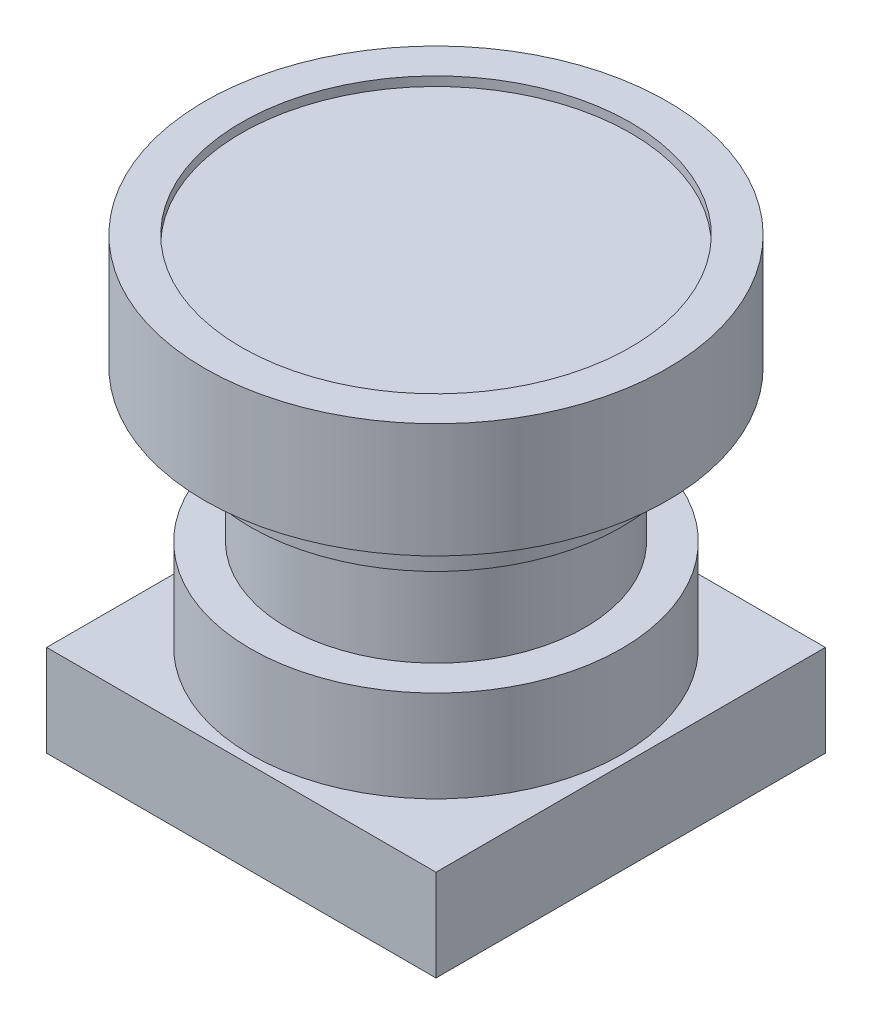
ISO-10303-21;
HEADER;
FILE_DESCRIPTION(('STEP AP214'),'2;1');
FILE_NAME('part.step','',(''),(''),'','','');
FILE_SCHEMA(('AUTOMOTIVE_DESIGN { 1 0 10303 214 1 1 1 1 }'));
ENDSEC;
DATA;
#1=APPLICATION_CONTEXT('core data for automotive mechanical design processes');
#2=APPLICATION_PROTOCOL_DEFINITION('international standard','automotive_design',2000,#1);
#3=PRODUCT_CONTEXT('',#1,'mechanical');
#4=PRODUCT('Part','Part','',(#3));
#5=PRODUCT_RELATED_PRODUCT_CATEGORY('part','',(#4));
#6=PRODUCT_DEFINITION_FORMATION('','',#4);
#7=PRODUCT_DEFINITION_CONTEXT('part definition',#1,'design');
#8=PRODUCT_DEFINITION('design','',#6,#7);
#9=PRODUCT_DEFINITION_SHAPE('','',#8);
#10=(LENGTH_UNIT() NAMED_UNIT(*) SI_UNIT(.MILLI.,.METRE.));
#11=(NAMED_UNIT(*) PLANE_ANGLE_UNIT() SI_UNIT($,.RADIAN.));
#12=(NAMED_UNIT(*) SI_UNIT($,.STERADIAN.) SOLID_ANGLE_UNIT());
#13=UNCERTAINTY_MEASURE_WITH_UNIT(LENGTH_MEASURE(1.E-05),#10,'distance_accuracy_value','');
#14=(GEOMETRIC_REPRESENTATION_CONTEXT(3) GLOBAL_UNCERTAINTY_ASSIGNED_CONTEXT((#13)) GLOBAL_UNIT_ASSIGNED_CONTEXT((#10,
#11,#12)) REPRESENTATION_CONTEXT('',''));
#15=CARTESIAN_POINT('',(0.,0.,0.));
#16=DIRECTION('',(0.,0.,1.));
#17=DIRECTION('',(1.,0.,0.));
#18=AXIS2_PLACEMENT_3D('',#15,#16,#17);
#19=CARTESIAN_POINT('',(-4.25,2.,-4.25));
#20=DIRECTION('',(1.,0.,0.));
#21=DIRECTION('',(0.,0.,-1.));
#22=AXIS2_PLACEMENT_3D('',#19,#20,#21);
#23=PLANE('',#22);
#24=DIRECTION('',(0.,0.,1.));
#25=VECTOR('',#24,1.);
#26=CARTESIAN_POINT('',(-4.25,0.,-4.25));
#27=LINE('',#26,#25);
#28=CARTESIAN_POINT('',(-4.25,0.,-4.25));
#29=VERTEX_POINT('',#28);
#30=CARTESIAN_POINT('',(-4.25,0.,4.25));
#31=VERTEX_POINT('',#30);
#32=EDGE_CURVE('E106',#29,#31,#27,.T.);
#33=ORIENTED_EDGE('',*,*,#32,.T.);
#34=DIRECTION('',(0.,-1.,0.));
#35=VECTOR('',#34,1.);
#36=CARTESIAN_POINT('',(-4.25,2.,4.25));
#37=LINE('',#36,#35);
#38=CARTESIAN_POINT('',(-4.25,2.,4.25));
#39=VERTEX_POINT('',#38);
#40=EDGE_CURVE('E11',#39,#31,#37,.T.);
#41=ORIENTED_EDGE('',*,*,#40,.F.);
#42=DIRECTION('',(0.,0.,1.));
#43=VECTOR('',#42,1.);
#44=CARTESIAN_POINT('',(-4.25,2.,-4.25));
#45=LINE('',#44,#43);
#46=CARTESIAN_POINT('',(-4.25,2.,-4.25));
#47=VERTEX_POINT('',#46);
#48=EDGE_CURVE('E94',#47,#39,#45,.T.);
#49=ORIENTED_EDGE('',*,*,#48,.F.);
#50=DIRECTION('',(0.,-1.,0.));
#51=VECTOR('',#50,1.);
#52=CARTESIAN_POINT('',(-4.25,2.,-4.25));
#53=LINE('',#52,#51);
#54=EDGE_CURVE('E102',#47,#29,#53,.T.);
#55=ORIENTED_EDGE('',*,*,#54,.T.);
#56=EDGE_LOOP('',(#33,#41,#49,#55));
#57=FACE_BOUND('',#56,.T.);
#58=ADVANCED_FACE('F43',(#57),#23,.F.);
#59=CARTESIAN_POINT('',(-4.25,2.,4.25));
#60=DIRECTION('',(0.,0.,-1.));
#61=DIRECTION('',(-1.,0.,0.));
#62=AXIS2_PLACEMENT_3D('',#59,#60,#61);
#63=PLANE('',#62);
#64=DIRECTION('',(1.,0.,0.));
#65=VECTOR('',#64,1.);
#66=CARTESIAN_POINT('',(-4.25,0.,4.25));
#67=LINE('',#66,#65);
#68=CARTESIAN_POINT('',(4.25,0.,4.25));
#69=VERTEX_POINT('',#68);
#70=EDGE_CURVE('E98',#31,#69,#67,.T.);
#71=ORIENTED_EDGE('',*,*,#70,.T.);
#72=DIRECTION('',(0.,-1.,0.));
#73=VECTOR('',#72,1.);
#74=CARTESIAN_POINT('',(4.25,2.,4.25));
#75=LINE('',#74,#73);
#76=CARTESIAN_POINT('',(4.25,2.,4.25));
#77=VERTEX_POINT('',#76);
#78=EDGE_CURVE('E51',#77,#69,#75,.T.);
#79=ORIENTED_EDGE('',*,*,#78,.F.);
#80=DIRECTION('',(1.,0.,0.));
#81=VECTOR('',#80,1.);
#82=CARTESIAN_POINT('',(-4.25,2.,4.25));
#83=LINE('',#82,#81);
#84=EDGE_CURVE('E89',#39,#77,#83,.T.);
#85=ORIENTED_EDGE('',*,*,#84,.F.);
#86=ORIENTED_EDGE('',*,*,#40,.T.);
#87=EDGE_LOOP('',(#71,#79,#85,#86));
#88=FACE_BOUND('',#87,.T.);
#89=ADVANCED_FACE('F97',(#88),#63,.F.);
#90=CARTESIAN_POINT('',(4.25,2.,-4.25));
#91=DIRECTION('',(-1.,0.,0.));
#92=DIRECTION('',(0.,0.,1.));
#93=AXIS2_PLACEMENT_3D('',#90,#91,#92);
#94=PLANE('',#93);
#95=DIRECTION('',(0.,0.,-1.));
#96=VECTOR('',#95,1.);
#97=CARTESIAN_POINT('',(4.25,0.,-4.25));
#98=LINE('',#97,#96);
#99=CARTESIAN_POINT('',(4.25,0.,-4.25));
#100=VERTEX_POINT('',#99);
#101=EDGE_CURVE('E76',#69,#100,#98,.T.);
#102=ORIENTED_EDGE('',*,*,#101,.T.);
#103=DIRECTION('',(0.,-1.,0.));
#104=VECTOR('',#103,1.);
#105=CARTESIAN_POINT('',(4.25,2.,-4.25));
#106=LINE('',#105,#104);
#107=CARTESIAN_POINT('',(4.25,2.,-4.25));
#108=VERTEX_POINT('',#107);
#109=EDGE_CURVE('E99',#108,#100,#106,.T.);
#110=ORIENTED_EDGE('',*,*,#109,.F.);
#111=DIRECTION('',(0.,0.,-1.));
#112=VECTOR('',#111,1.);
#113=CARTESIAN_POINT('',(4.25,2.,-4.25));
#114=LINE('',#113,#112);
#115=EDGE_CURVE('E92',#77,#108,#114,.T.);
#116=ORIENTED_EDGE('',*,*,#115,.F.);
#117=ORIENTED_EDGE('',*,*,#78,.T.);
#118=EDGE_LOOP('',(#102,#110,#116,#117));
#119=FACE_BOUND('',#118,.T.);
#120=ADVANCED_FACE('F100',(#119),#94,.F.);
#121=CARTESIAN_POINT('',(-4.25,2.,-4.25));
#122=DIRECTION('',(0.,0.,1.));
#123=DIRECTION('',(1.,0.,0.));
#124=AXIS2_PLACEMENT_3D('',#121,#122,#123);
#125=PLANE('',#124);
#126=DIRECTION('',(-1.,0.,0.));
#127=VECTOR('',#126,1.);
#128=CARTESIAN_POINT('',(-4.25,0.,-4.25));
#129=LINE('',#128,#127);
#130=EDGE_CURVE('E82',#100,#29,#129,.T.);
#131=ORIENTED_EDGE('',*,*,#130,.T.);
#132=ORIENTED_EDGE('',*,*,#54,.F.);
#133=DIRECTION('',(-1.,0.,0.));
#134=VECTOR('',#133,1.);
#135=CARTESIAN_POINT('',(-4.25,2.,-4.25));
#136=LINE('',#135,#134);
#137=EDGE_CURVE('E59',#108,#47,#136,.T.);
#138=ORIENTED_EDGE('',*,*,#137,.F.);
#139=ORIENTED_EDGE('',*,*,#109,.T.);
#140=EDGE_LOOP('',(#131,#132,#138,#139));
#141=FACE_BOUND('',#140,.T.);
#142=ADVANCED_FACE('F114',(#141),#125,.F.);
#143=CARTESIAN_POINT('',(0.,2.,0.));
#144=DIRECTION('',(0.,1.,0.));
#145=DIRECTION('',(0.,0.,1.));
#146=AXIS2_PLACEMENT_3D('',#143,#144,#145);
#147=PLANE('',#146);
#148=CARTESIAN_POINT('',(0.,2.,0.));
#149=DIRECTION('',(0.,1.,0.));
#150=DIRECTION('',(0.,0.,1.));
#151=AXIS2_PLACEMENT_3D('',#148,#149,#150);
#152=CIRCLE('',#151,4.05);
#153=CARTESIAN_POINT('',(0.,2.,4.05));
#154=VERTEX_POINT('',#153);
#155=EDGE_CURVE('E120',#154,#154,#152,.T.);
#156=ORIENTED_EDGE('',*,*,#155,.F.);
#157=EDGE_LOOP('',(#156));
#158=FACE_BOUND('',#157,.T.);
#159=ORIENTED_EDGE('',*,*,#48,.T.);
#160=ORIENTED_EDGE('',*,*,#84,.T.);
#161=ORIENTED_EDGE('',*,*,#115,.T.);
#162=ORIENTED_EDGE('',*,*,#137,.T.);
#163=EDGE_LOOP('',(#159,#160,#161,#162));
#164=FACE_BOUND('',#163,.T.);
#165=ADVANCED_FACE('F90',(#158,#164),#147,.T.);
#166=CARTESIAN_POINT('',(0.,0.,0.));
#167=DIRECTION('',(0.,1.,0.));
#168=DIRECTION('',(0.,0.,1.));
#169=AXIS2_PLACEMENT_3D('',#166,#167,#168);
#170=PLANE('',#169);
#171=ORIENTED_EDGE('',*,*,#32,.F.);
#172=ORIENTED_EDGE('',*,*,#130,.F.);
#173=ORIENTED_EDGE('',*,*,#101,.F.);
#174=ORIENTED_EDGE('',*,*,#70,.F.);
#175=EDGE_LOOP('',(#171,#172,#173,#174));
#176=FACE_BOUND('',#175,.T.);
#177=ADVANCED_FACE('F117',(#176),#170,.F.);
#178=CARTESIAN_POINT('',(0.,4.,0.));
#179=DIRECTION('',(0.,1.,0.));
#180=DIRECTION('',(0.,0.,1.));
#181=AXIS2_PLACEMENT_3D('',#178,#179,#180);
#182=PLANE('',#181);
#183=CARTESIAN_POINT('',(0.,4.,0.));
#184=DIRECTION('',(0.,1.,0.));
#185=DIRECTION('',(0.,0.,1.));
#186=AXIS2_PLACEMENT_3D('',#183,#184,#185);
#187=CIRCLE('',#186,4.05);
#188=CARTESIAN_POINT('',(0.,4.,4.05));
#189=VERTEX_POINT('',#188);
#190=EDGE_CURVE('E109',#189,#189,#187,.T.);
#191=ORIENTED_EDGE('',*,*,#190,.T.);
#192=EDGE_LOOP('',(#191));
#193=FACE_BOUND('',#192,.T.);
#194=CARTESIAN_POINT('',(0.,4.,0.));
#195=DIRECTION('',(0.,1.,0.));
#196=DIRECTION('',(0.,0.,1.));
#197=AXIS2_PLACEMENT_3D('',#194,#195,#196);
#198=CIRCLE('',#197,3.25);
#199=CARTESIAN_POINT('',(0.,4.,-3.25));
#200=VERTEX_POINT('',#199);
#201=EDGE_CURVE('E123',#200,#200,#198,.T.);
#202=ORIENTED_EDGE('',*,*,#201,.F.);
#203=EDGE_LOOP('',(#202));
#204=FACE_BOUND('',#203,.T.);
#205=ADVANCED_FACE('F187',(#193,#204),#182,.T.);
#206=CARTESIAN_POINT('',(0.,4.,0.));
#207=DIRECTION('',(0.,-1.,0.));
#208=DIRECTION('',(0.,0.,-1.));
#209=AXIS2_PLACEMENT_3D('',#206,#207,#208);
#210=CYLINDRICAL_SURFACE('',#209,4.05);
#211=ORIENTED_EDGE('',*,*,#190,.F.);
#212=EDGE_LOOP('',(#211));
#213=FACE_BOUND('',#212,.T.);
#214=ORIENTED_EDGE('',*,*,#155,.T.);
#215=EDGE_LOOP('',(#214));
#216=FACE_BOUND('',#215,.T.);
#217=ADVANCED_FACE('F191',(#213,#216),#210,.T.);
#218=CARTESIAN_POINT('',(0.,6.3,0.));
#219=DIRECTION('',(0.,-1.,0.));
#220=DIRECTION('',(0.,0.,-1.));
#221=AXIS2_PLACEMENT_3D('',#218,#219,#220);
#222=CYLINDRICAL_SURFACE('',#221,3.25);
#223=CARTESIAN_POINT('',(0.,6.3,0.));
#224=DIRECTION('',(0.,1.,0.));
#225=DIRECTION('',(0.,0.,1.));
#226=AXIS2_PLACEMENT_3D('',#223,#224,#225);
#227=CIRCLE('',#226,3.25);
#228=CARTESIAN_POINT('',(0.,6.3,-3.25));
#229=VERTEX_POINT('',#228);
#230=EDGE_CURVE('E128',#229,#229,#227,.T.);
#231=CARTESIAN_POINT('',(0.,4.,-3.25));
#232=CARTESIAN_POINT('',(0.,4.02395833333333,-3.25));
#233=CARTESIAN_POINT('',(0.,4.04791666666667,-3.25));
#234=CARTESIAN_POINT('',(0.,4.09583333333333,-3.25));
#235=CARTESIAN_POINT('',(0.,4.11979166666667,-3.25));
#236=CARTESIAN_POINT('',(0.,4.16770833333333,-3.25));
#237=CARTESIAN_POINT('',(0.,4.19166666666667,-3.25));
#238=CARTESIAN_POINT('',(0.,4.23958333333333,-3.25));
#239=CARTESIAN_POINT('',(0.,4.26354166666667,-3.25));
#240=CARTESIAN_POINT('',(0.,4.31145833333333,-3.25));
#241=CARTESIAN_POINT('',(0.,4.33541666666667,-3.25));
#242=CARTESIAN_POINT('',(0.,4.38333333333333,-3.25));
#243=CARTESIAN_POINT('',(0.,4.40729166666667,-3.25));
#244=CARTESIAN_POINT('',(0.,4.45520833333333,-3.25));
#245=CARTESIAN_POINT('',(0.,4.47916666666667,-3.25));
#246=CARTESIAN_POINT('',(0.,4.52708333333333,-3.25));
#247=CARTESIAN_POINT('',(0.,4.55104166666667,-3.25));
#248=CARTESIAN_POINT('',(0.,4.59895833333333,-3.25));
#249=CARTESIAN_POINT('',(0.,4.62291666666667,-3.25));
#250=CARTESIAN_POINT('',(0.,4.67083333333333,-3.25));
#251=CARTESIAN_POINT('',(0.,4.69479166666667,-3.25));
#252=CARTESIAN_POINT('',(0.,4.74270833333333,-3.25));
#253=CARTESIAN_POINT('',(0.,4.76666666666667,-3.25));
#254=CARTESIAN_POINT('',(0.,4.81458333333333,-3.25));
#255=CARTESIAN_POINT('',(0.,4.83854166666667,-3.25));
#256=CARTESIAN_POINT('',(0.,4.88645833333333,-3.25));
#257=CARTESIAN_POINT('',(0.,4.91041666666667,-3.25));
#258=CARTESIAN_POINT('',(0.,4.95833333333333,-3.25));
#259=CARTESIAN_POINT('',(0.,4.98229166666667,-3.25));
#260=CARTESIAN_POINT('',(0.,5.03020833333333,-3.25));
#261=CARTESIAN_POINT('',(0.,5.05416666666667,-3.25));
#262=CARTESIAN_POINT('',(0.,5.10208333333333,-3.25));
#263=CARTESIAN_POINT('',(0.,5.12604166666667,-3.25));
#264=CARTESIAN_POINT('',(0.,5.17395833333333,-3.25));
#265=CARTESIAN_POINT('',(0.,5.19791666666667,-3.25));
#266=CARTESIAN_POINT('',(0.,5.24583333333333,-3.25));
#267=CARTESIAN_POINT('',(0.,5.26979166666667,-3.25));
#268=CARTESIAN_POINT('',(0.,5.31770833333333,-3.25));
#269=CARTESIAN_POINT('',(0.,5.34166666666667,-3.25));
#270=CARTESIAN_POINT('',(0.,5.38958333333333,-3.25));
#271=CARTESIAN_POINT('',(0.,5.41354166666667,-3.25));
#272=CARTESIAN_POINT('',(0.,5.46145833333333,-3.25));
#273=CARTESIAN_POINT('',(0.,5.48541666666667,-3.25));
#274=CARTESIAN_POINT('',(0.,5.53333333333333,-3.25));
#275=CARTESIAN_POINT('',(0.,5.55729166666667,-3.25));
#276=CARTESIAN_POINT('',(0.,5.60520833333333,-3.25));
#277=CARTESIAN_POINT('',(0.,5.62916666666667,-3.25));
#278=CARTESIAN_POINT('',(0.,5.67708333333333,-3.25));
#279=CARTESIAN_POINT('',(0.,5.70104166666667,-3.25));
#280=CARTESIAN_POINT('',(0.,5.74895833333333,-3.25));
#281=CARTESIAN_POINT('',(0.,5.77291666666667,-3.25));
#282=CARTESIAN_POINT('',(0.,5.82083333333333,-3.25));
#283=CARTESIAN_POINT('',(0.,5.84479166666667,-3.25));
#284=CARTESIAN_POINT('',(0.,5.89270833333333,-3.25));
#285=CARTESIAN_POINT('',(0.,5.91666666666667,-3.25));
#286=CARTESIAN_POINT('',(0.,5.96458333333333,-3.25));
#287=CARTESIAN_POINT('',(0.,5.98854166666667,-3.25));
#288=CARTESIAN_POINT('',(0.,6.03645833333333,-3.25));
#289=CARTESIAN_POINT('',(0.,6.06041666666667,-3.25));
#290=CARTESIAN_POINT('',(0.,6.10833333333333,-3.25));
#291=CARTESIAN_POINT('',(0.,6.13229166666667,-3.25));
#292=CARTESIAN_POINT('',(0.,6.18020833333333,-3.25));
#293=CARTESIAN_POINT('',(0.,6.20416666666667,-3.25));
#294=CARTESIAN_POINT('',(0.,6.25208333333333,-3.25));
#295=CARTESIAN_POINT('',(0.,6.27604166666667,-3.25));
#296=CARTESIAN_POINT('',(0.,6.3,-3.25));
#297=B_SPLINE_CURVE_WITH_KNOTS('',3,(#231,#232,#233,#234,#235,#236,#237,#238,#239,#240,#241,
#242,#243,#244,#245,#246,#247,#248,#249,#250,#251,#252,#253,#254,#255,#256,#257,#258,#259,#260,
#261,#262,#263,#264,#265,#266,#267,#268,#269,#270,#271,#272,#273,#274,#275,#276,#277,#278,#279,
#280,#281,#282,#283,#284,#285,#286,#287,#288,#289,#290,#291,#292,#293,#294,#295,#296),
.UNSPECIFIED.,.F.,.F.,(4,2,2,2,2,2,2,2,2,2,2,2,2,2,2,2,2,2,2,2,2,2,2,2,2,2,2,2,2,2,2,2,4),(0.,
0.071874999999999,0.14375,0.215625,0.2875,0.359374999999999,0.431249999999999,0.503124999999999,
0.574999999999999,0.646875,0.71875,0.790625,0.8625,0.934374999999999,1.00625,1.078125,1.15,
1.221875,1.29375,1.365625,1.4375,1.509375,1.58125,1.653125,1.725,1.796875,1.86875,1.940625,
2.0125,2.084375,2.15625,2.228125,2.3),.UNSPECIFIED.);
#298=EDGE_CURVE('BSEAM194',#200,#229,#297,.T.);
#299=ORIENTED_EDGE('',*,*,#201,.T.);
#300=ORIENTED_EDGE('',*,*,#230,.F.);
#301=ORIENTED_EDGE('',*,*,#298,.T.);
#302=ORIENTED_EDGE('',*,*,#298,.F.);
#303=EDGE_LOOP('',(#299,#301,#300,#302));
#304=FACE_BOUND('',#303,.T.);
#305=ADVANCED_FACE('F194',(#304),#222,.T.);
#306=CARTESIAN_POINT('',(0.,7.3,0.));
#307=DIRECTION('',(0.,-1.,0.));
#308=DIRECTION('',(0.,0.,-1.));
#309=AXIS2_PLACEMENT_3D('',#306,#307,#308);
#310=CYLINDRICAL_SURFACE('',#309,4.05);
#311=CARTESIAN_POINT('',(0.,7.3,0.));
#312=DIRECTION('',(0.,1.,0.));
#313=DIRECTION('',(0.,0.,1.));
#314=AXIS2_PLACEMENT_3D('',#311,#312,#313);
#315=CIRCLE('',#314,4.05);
#316=CARTESIAN_POINT('',(0.,7.3,4.05));
#317=VERTEX_POINT('',#316);
#318=EDGE_CURVE('E131',#317,#317,#315,.T.);
#319=ORIENTED_EDGE('',*,*,#318,.F.);
#320=EDGE_LOOP('',(#319));
#321=FACE_BOUND('',#320,.T.);
#322=CARTESIAN_POINT('',(0.,6.3,0.));
#323=DIRECTION('',(0.,1.,0.));
#324=DIRECTION('',(0.,0.,1.));
#325=AXIS2_PLACEMENT_3D('',#322,#323,#324);
#326=CIRCLE('',#325,4.05);
#327=CARTESIAN_POINT('',(0.,6.3,4.05));
#328=VERTEX_POINT('',#327);
#329=EDGE_CURVE('E132',#328,#328,#326,.T.);
#330=ORIENTED_EDGE('',*,*,#329,.T.);
#331=EDGE_LOOP('',(#330));
#332=FACE_BOUND('',#331,.T.);
#333=ADVANCED_FACE('F201',(#321,#332),#310,.T.);
#334=CARTESIAN_POINT('',(0.,6.3,0.));
#335=DIRECTION('',(0.,1.,0.));
#336=DIRECTION('',(0.,0.,1.));
#337=AXIS2_PLACEMENT_3D('',#334,#335,#336);
#338=PLANE('',#337);
#339=ORIENTED_EDGE('',*,*,#230,.T.);
#340=EDGE_LOOP('',(#339));
#341=FACE_BOUND('',#340,.T.);
#342=ORIENTED_EDGE('',*,*,#329,.F.);
#343=EDGE_LOOP('',(#342));
#344=FACE_BOUND('',#343,.T.);
#345=ADVANCED_FACE('F168',(#341,#344),#338,.F.);
#346=CARTESIAN_POINT('',(0.,9.8,0.));
#347=DIRECTION('',(0.,-1.,0.));
#348=DIRECTION('',(0.,0.,-1.));
#349=AXIS2_PLACEMENT_3D('',#346,#347,#348);
#350=CYLINDRICAL_SURFACE('',#349,5.05);
#351=CARTESIAN_POINT('',(0.,9.8,0.));
#352=DIRECTION('',(0.,1.,0.));
#353=DIRECTION('',(0.,0.,1.));
#354=AXIS2_PLACEMENT_3D('',#351,#352,#353);
#355=CIRCLE('',#354,5.05);
#356=CARTESIAN_POINT('',(0.,9.8,5.05));
#357=VERTEX_POINT('',#356);
#358=EDGE_CURVE('E135',#357,#357,#355,.T.);
#359=ORIENTED_EDGE('',*,*,#358,.F.);
#360=EDGE_LOOP('',(#359));
#361=FACE_BOUND('',#360,.T.);
#362=CARTESIAN_POINT('',(0.,7.3,0.));
#363=DIRECTION('',(0.,1.,0.));
#364=DIRECTION('',(0.,0.,1.));
#365=AXIS2_PLACEMENT_3D('',#362,#363,#364);
#366=CIRCLE('',#365,5.05);
#367=CARTESIAN_POINT('',(0.,7.3,5.05));
#368=VERTEX_POINT('',#367);
#369=EDGE_CURVE('E138',#368,#368,#366,.T.);
#370=ORIENTED_EDGE('',*,*,#369,.T.);
#371=EDGE_LOOP('',(#370));
#372=FACE_BOUND('',#371,.T.);
#373=ADVANCED_FACE('F162',(#361,#372),#350,.T.);
#374=CARTESIAN_POINT('',(0.,9.8,0.));
#375=DIRECTION('',(0.,1.,0.));
#376=DIRECTION('',(0.,0.,1.));
#377=AXIS2_PLACEMENT_3D('',#374,#375,#376);
#378=PLANE('',#377);
#379=CARTESIAN_POINT('',(0.,9.8,0.));
#380=DIRECTION('',(0.,1.,0.));
#381=DIRECTION('',(0.,0.,1.));
#382=AXIS2_PLACEMENT_3D('',#379,#380,#381);
#383=CIRCLE('',#382,4.25);
#384=CARTESIAN_POINT('',(0.,9.8,4.25));
#385=VERTEX_POINT('',#384);
#386=EDGE_CURVE('E144',#385,#385,#383,.T.);
#387=ORIENTED_EDGE('',*,*,#386,.F.);
#388=EDGE_LOOP('',(#387));
#389=FACE_BOUND('',#388,.T.);
#390=ORIENTED_EDGE('',*,*,#358,.T.);
#391=EDGE_LOOP('',(#390));
#392=FACE_BOUND('',#391,.T.);
#393=ADVANCED_FACE('F159',(#389,#392),#378,.T.);
#394=CARTESIAN_POINT('',(0.,7.3,0.));
#395=DIRECTION('',(0.,1.,0.));
#396=DIRECTION('',(0.,0.,1.));
#397=AXIS2_PLACEMENT_3D('',#394,#395,#396);
#398=PLANE('',#397);
#399=ORIENTED_EDGE('',*,*,#318,.T.);
#400=EDGE_LOOP('',(#399));
#401=FACE_BOUND('',#400,.T.);
#402=ORIENTED_EDGE('',*,*,#369,.F.);
#403=EDGE_LOOP('',(#402));
#404=FACE_BOUND('',#403,.T.);
#405=ADVANCED_FACE('F155',(#401,#404),#398,.F.);
#406=CARTESIAN_POINT('',(0.,9.6,0.));
#407=DIRECTION('',(0.,1.,0.));
#408=DIRECTION('',(0.,0.,1.));
#409=AXIS2_PLACEMENT_3D('',#406,#407,#408);
#410=CYLINDRICAL_SURFACE('',#409,4.25);
#411=CARTESIAN_POINT('',(0.,9.6,0.));
#412=DIRECTION('',(0.,1.,0.));
#413=DIRECTION('',(0.,0.,1.));
#414=AXIS2_PLACEMENT_3D('',#411,#412,#413);
#415=CIRCLE('',#414,4.25);
#416=CARTESIAN_POINT('',(0.,9.6,4.25));
#417=VERTEX_POINT('',#416);
#418=EDGE_CURVE('E141',#417,#417,#415,.T.);
#419=ORIENTED_EDGE('',*,*,#418,.F.);
#420=EDGE_LOOP('',(#419));
#421=FACE_BOUND('',#420,.T.);
#422=ORIENTED_EDGE('',*,*,#386,.T.);
#423=EDGE_LOOP('',(#422));
#424=FACE_BOUND('',#423,.T.);
#425=ADVANCED_FACE('F152',(#421,#424),#410,.F.);
#426=CARTESIAN_POINT('',(0.,9.6,0.));
#427=DIRECTION('',(0.,1.,0.));
#428=DIRECTION('',(0.,0.,1.));
#429=AXIS2_PLACEMENT_3D('',#426,#427,#428);
#430=PLANE('',#429);
#431=ORIENTED_EDGE('',*,*,#418,.T.);
#432=EDGE_LOOP('',(#431));
#433=FACE_BOUND('',#432,.T.);
#434=ADVANCED_FACE('F150',(#433),#430,.T.);
#435=CLOSED_SHELL('',(#58,#89,#120,#142,#165,#177,#205,#217,#305,#333,#345,#373,#393,#405,#425,#434));
#436=MANIFOLD_SOLID_BREP('B2',#435);
#437=ADVANCED_BREP_SHAPE_REPRESENTATION('',(#18,#436),#14);
#438=SHAPE_DEFINITION_REPRESENTATION(#9,#437);
ENDSEC;
END-ISO-10303-21;
